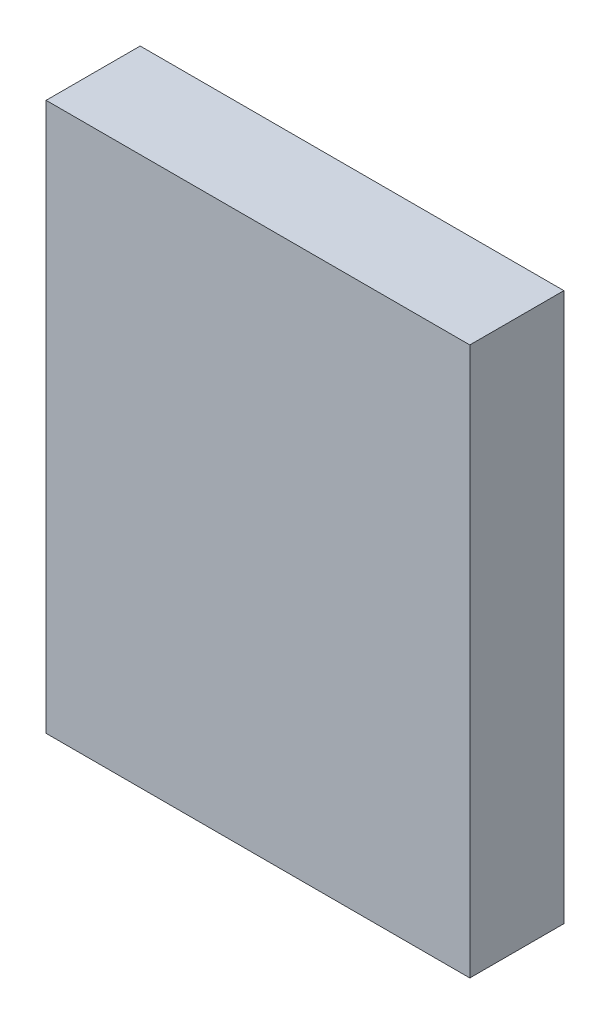
ISO-10303-21;
HEADER;
FILE_DESCRIPTION(('STEP AP214'),'2;1');
FILE_NAME('part.step','',(''),(''),'','','');
FILE_SCHEMA(('AUTOMOTIVE_DESIGN { 1 0 10303 214 1 1 1 1 }'));
ENDSEC;
DATA;
#1=APPLICATION_CONTEXT('core data for automotive mechanical design processes');
#2=APPLICATION_PROTOCOL_DEFINITION('international standard','automotive_design',2000,#1);
#3=PRODUCT_CONTEXT('',#1,'mechanical');
#4=PRODUCT('Part','Part','',(#3));
#5=PRODUCT_RELATED_PRODUCT_CATEGORY('part','',(#4));
#6=PRODUCT_DEFINITION_FORMATION('','',#4);
#7=PRODUCT_DEFINITION_CONTEXT('part definition',#1,'design');
#8=PRODUCT_DEFINITION('design','',#6,#7);
#9=PRODUCT_DEFINITION_SHAPE('','',#8);
#10=(LENGTH_UNIT() NAMED_UNIT(*) SI_UNIT(.MILLI.,.METRE.));
#11=(NAMED_UNIT(*) PLANE_ANGLE_UNIT() SI_UNIT($,.RADIAN.));
#12=(NAMED_UNIT(*) SI_UNIT($,.STERADIAN.) SOLID_ANGLE_UNIT());
#13=UNCERTAINTY_MEASURE_WITH_UNIT(LENGTH_MEASURE(1.E-05),#10,'distance_accuracy_value','');
#14=(GEOMETRIC_REPRESENTATION_CONTEXT(3) GLOBAL_UNCERTAINTY_ASSIGNED_CONTEXT((#13)) GLOBAL_UNIT_ASSIGNED_CONTEXT((#10,
#11,#12)) REPRESENTATION_CONTEXT('',''));
#15=CARTESIAN_POINT('',(0.,0.,0.));
#16=DIRECTION('',(0.,0.,1.));
#17=DIRECTION('',(1.,0.,0.));
#18=AXIS2_PLACEMENT_3D('',#15,#16,#17);
#19=CARTESIAN_POINT('',(-0.580389999999998,-0.3324098,1.1100054));
#20=DIRECTION('',(1.,0.,0.));
#21=DIRECTION('',(0.,0.,-1.));
#22=AXIS2_PLACEMENT_3D('',#19,#20,#21);
#23=PLANE('',#22);
#24=DIRECTION('',(0.,-1.,0.));
#25=VECTOR('',#24,1.);
#26=CARTESIAN_POINT('',(-0.580389999999998,-0.3324098,0.));
#27=LINE('',#26,#25);
#28=CARTESIAN_POINT('',(-0.580389999999998,6.1372242,0.));
#29=VERTEX_POINT('',#28);
#30=CARTESIAN_POINT('',(-0.580389999999998,-0.3324098,0.));
#31=VERTEX_POINT('',#30);
#32=EDGE_CURVE('E95',#29,#31,#27,.T.);
#33=ORIENTED_EDGE('',*,*,#32,.T.);
#34=DIRECTION('',(0.,0.,-1.));
#35=VECTOR('',#34,1.);
#36=CARTESIAN_POINT('',(-0.580389999999998,-0.3324098,1.1100054));
#37=LINE('',#36,#35);
#38=CARTESIAN_POINT('',(-0.580389999999998,-0.3324098,1.1100054));
#39=VERTEX_POINT('',#38);
#40=EDGE_CURVE('E11',#39,#31,#37,.T.);
#41=ORIENTED_EDGE('',*,*,#40,.F.);
#42=DIRECTION('',(0.,-1.,0.));
#43=VECTOR('',#42,1.);
#44=CARTESIAN_POINT('',(-0.580389999999998,-0.3324098,1.1100054));
#45=LINE('',#44,#43);
#46=CARTESIAN_POINT('',(-0.580389999999998,6.1372242,1.1100054));
#47=VERTEX_POINT('',#46);
#48=EDGE_CURVE('E83',#47,#39,#45,.T.);
#49=ORIENTED_EDGE('',*,*,#48,.F.);
#50=DIRECTION('',(0.,0.,-1.));
#51=VECTOR('',#50,1.);
#52=CARTESIAN_POINT('',(-0.580389999999998,6.1372242,1.1100054));
#53=LINE('',#52,#51);
#54=EDGE_CURVE('E91',#47,#29,#53,.T.);
#55=ORIENTED_EDGE('',*,*,#54,.T.);
#56=EDGE_LOOP('',(#33,#41,#49,#55));
#57=FACE_BOUND('',#56,.T.);
#58=ADVANCED_FACE('F32',(#57),#23,.F.);
#59=CARTESIAN_POINT('',(4.4196,-0.3324098,1.1100054));
#60=DIRECTION('',(0.,1.,0.));
#61=DIRECTION('',(0.,0.,1.));
#62=AXIS2_PLACEMENT_3D('',#59,#60,#61);
#63=PLANE('',#62);
#64=DIRECTION('',(1.,0.,0.));
#65=VECTOR('',#64,1.);
#66=CARTESIAN_POINT('',(4.4196,-0.3324098,0.));
#67=LINE('',#66,#65);
#68=CARTESIAN_POINT('',(4.4196,-0.3324098,0.));
#69=VERTEX_POINT('',#68);
#70=EDGE_CURVE('E87',#31,#69,#67,.T.);
#71=ORIENTED_EDGE('',*,*,#70,.T.);
#72=DIRECTION('',(0.,0.,-1.));
#73=VECTOR('',#72,1.);
#74=CARTESIAN_POINT('',(4.4196,-0.3324098,1.1100054));
#75=LINE('',#74,#73);
#76=CARTESIAN_POINT('',(4.4196,-0.3324098,1.1100054));
#77=VERTEX_POINT('',#76);
#78=EDGE_CURVE('E40',#77,#69,#75,.T.);
#79=ORIENTED_EDGE('',*,*,#78,.F.);
#80=DIRECTION('',(1.,0.,0.));
#81=VECTOR('',#80,1.);
#82=CARTESIAN_POINT('',(4.4196,-0.3324098,1.1100054));
#83=LINE('',#82,#81);
#84=EDGE_CURVE('E78',#39,#77,#83,.T.);
#85=ORIENTED_EDGE('',*,*,#84,.F.);
#86=ORIENTED_EDGE('',*,*,#40,.T.);
#87=EDGE_LOOP('',(#71,#79,#85,#86));
#88=FACE_BOUND('',#87,.T.);
#89=ADVANCED_FACE('F86',(#88),#63,.F.);
#90=CARTESIAN_POINT('',(4.4196,6.1372242,1.1100054));
#91=DIRECTION('',(-1.,0.,0.));
#92=DIRECTION('',(0.,0.,1.));
#93=AXIS2_PLACEMENT_3D('',#90,#91,#92);
#94=PLANE('',#93);
#95=DIRECTION('',(0.,1.,0.));
#96=VECTOR('',#95,1.);
#97=CARTESIAN_POINT('',(4.4196,6.1372242,0.));
#98=LINE('',#97,#96);
#99=CARTESIAN_POINT('',(4.4196,6.1372242,0.));
#100=VERTEX_POINT('',#99);
#101=EDGE_CURVE('E65',#69,#100,#98,.T.);
#102=ORIENTED_EDGE('',*,*,#101,.T.);
#103=DIRECTION('',(0.,0.,-1.));
#104=VECTOR('',#103,1.);
#105=CARTESIAN_POINT('',(4.4196,6.1372242,1.1100054));
#106=LINE('',#105,#104);
#107=CARTESIAN_POINT('',(4.4196,6.1372242,1.1100054));
#108=VERTEX_POINT('',#107);
#109=EDGE_CURVE('E88',#108,#100,#106,.T.);
#110=ORIENTED_EDGE('',*,*,#109,.F.);
#111=DIRECTION('',(0.,1.,0.));
#112=VECTOR('',#111,1.);
#113=CARTESIAN_POINT('',(4.4196,6.1372242,1.1100054));
#114=LINE('',#113,#112);
#115=EDGE_CURVE('E81',#77,#108,#114,.T.);
#116=ORIENTED_EDGE('',*,*,#115,.F.);
#117=ORIENTED_EDGE('',*,*,#78,.T.);
#118=EDGE_LOOP('',(#102,#110,#116,#117));
#119=FACE_BOUND('',#118,.T.);
#120=ADVANCED_FACE('F89',(#119),#94,.F.);
#121=CARTESIAN_POINT('',(-0.580389999999998,6.1372242,1.1100054));
#122=DIRECTION('',(0.,-1.,0.));
#123=DIRECTION('',(0.,0.,-1.));
#124=AXIS2_PLACEMENT_3D('',#121,#122,#123);
#125=PLANE('',#124);
#126=DIRECTION('',(-1.,0.,0.));
#127=VECTOR('',#126,1.);
#128=CARTESIAN_POINT('',(-0.580389999999998,6.1372242,0.));
#129=LINE('',#128,#127);
#130=EDGE_CURVE('E71',#100,#29,#129,.T.);
#131=ORIENTED_EDGE('',*,*,#130,.T.);
#132=ORIENTED_EDGE('',*,*,#54,.F.);
#133=DIRECTION('',(-1.,0.,0.));
#134=VECTOR('',#133,1.);
#135=CARTESIAN_POINT('',(-0.580389999999998,6.1372242,1.1100054));
#136=LINE('',#135,#134);
#137=EDGE_CURVE('E48',#108,#47,#136,.T.);
#138=ORIENTED_EDGE('',*,*,#137,.F.);
#139=ORIENTED_EDGE('',*,*,#109,.T.);
#140=EDGE_LOOP('',(#131,#132,#138,#139));
#141=FACE_BOUND('',#140,.T.);
#142=ADVANCED_FACE('F102',(#141),#125,.F.);
#143=CARTESIAN_POINT('',(0.,0.,1.1100054));
#144=DIRECTION('',(0.,0.,-1.));
#145=DIRECTION('',(-1.,0.,0.));
#146=AXIS2_PLACEMENT_3D('',#143,#144,#145);
#147=PLANE('',#146);
#148=ORIENTED_EDGE('',*,*,#48,.T.);
#149=ORIENTED_EDGE('',*,*,#84,.T.);
#150=ORIENTED_EDGE('',*,*,#115,.T.);
#151=ORIENTED_EDGE('',*,*,#137,.T.);
#152=EDGE_LOOP('',(#148,#149,#150,#151));
#153=FACE_BOUND('',#152,.T.);
#154=ADVANCED_FACE('F79',(#153),#147,.F.);
#155=CARTESIAN_POINT('',(0.,0.,0.));
#156=DIRECTION('',(0.,0.,-1.));
#157=DIRECTION('',(-1.,0.,0.));
#158=AXIS2_PLACEMENT_3D('',#155,#156,#157);
#159=PLANE('',#158);
#160=ORIENTED_EDGE('',*,*,#32,.F.);
#161=ORIENTED_EDGE('',*,*,#130,.F.);
#162=ORIENTED_EDGE('',*,*,#101,.F.);
#163=ORIENTED_EDGE('',*,*,#70,.F.);
#164=EDGE_LOOP('',(#160,#161,#162,#163));
#165=FACE_BOUND('',#164,.T.);
#166=ADVANCED_FACE('F105',(#165),#159,.T.);
#167=CLOSED_SHELL('',(#58,#89,#120,#142,#154,#166));
#168=MANIFOLD_SOLID_BREP('B2',#167);
#169=ADVANCED_BREP_SHAPE_REPRESENTATION('',(#18,#168),#14);
#170=SHAPE_DEFINITION_REPRESENTATION(#9,#169);
ENDSEC;
END-ISO-10303-21;
